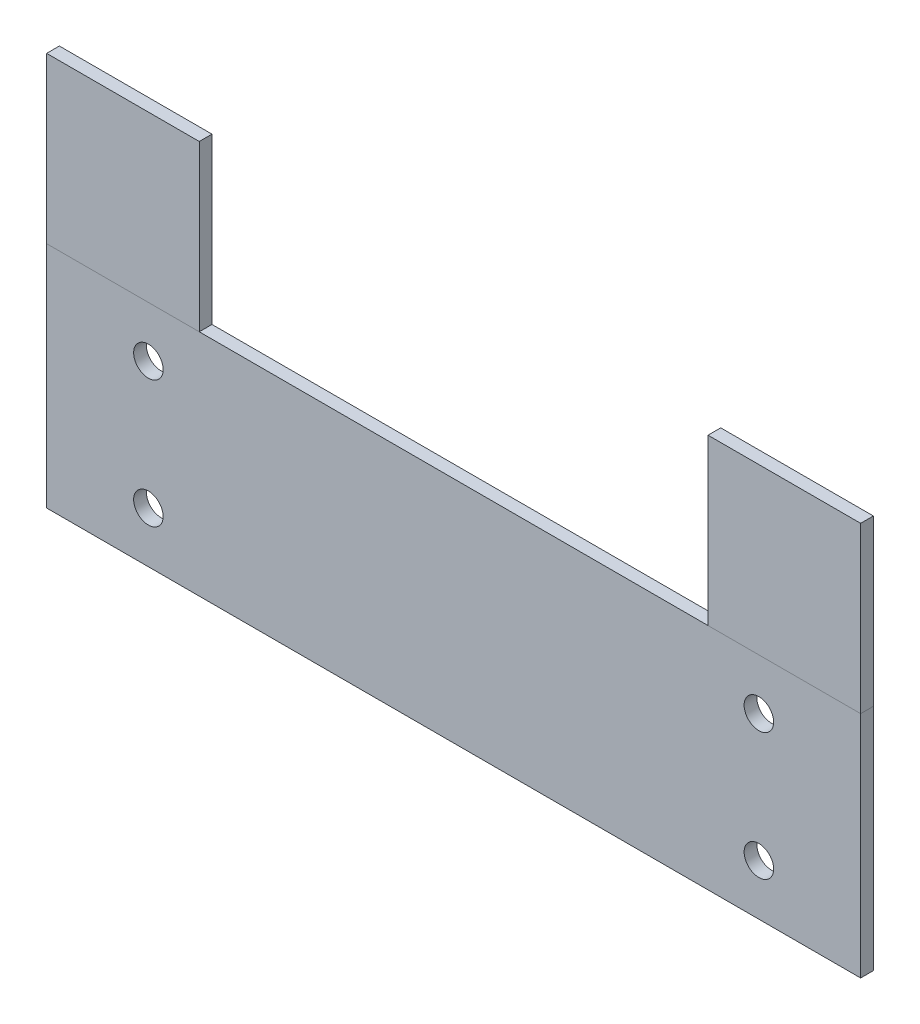
ISO-10303-21;
HEADER;
FILE_DESCRIPTION(('STEP AP214'),'2;1');
FILE_NAME('part.step','',(''),(''),'','','');
FILE_SCHEMA(('AUTOMOTIVE_DESIGN { 1 0 10303 214 1 1 1 1 }'));
ENDSEC;
DATA;
#1=APPLICATION_CONTEXT('core data for automotive mechanical design processes');
#2=APPLICATION_PROTOCOL_DEFINITION('international standard','automotive_design',2000,#1);
#3=PRODUCT_CONTEXT('',#1,'mechanical');
#4=PRODUCT('Part','Part','',(#3));
#5=PRODUCT_RELATED_PRODUCT_CATEGORY('part','',(#4));
#6=PRODUCT_DEFINITION_FORMATION('','',#4);
#7=PRODUCT_DEFINITION_CONTEXT('part definition',#1,'design');
#8=PRODUCT_DEFINITION('design','',#6,#7);
#9=PRODUCT_DEFINITION_SHAPE('','',#8);
#10=(LENGTH_UNIT() NAMED_UNIT(*) SI_UNIT(.MILLI.,.METRE.));
#11=(NAMED_UNIT(*) PLANE_ANGLE_UNIT() SI_UNIT($,.RADIAN.));
#12=(NAMED_UNIT(*) SI_UNIT($,.STERADIAN.) SOLID_ANGLE_UNIT());
#13=UNCERTAINTY_MEASURE_WITH_UNIT(LENGTH_MEASURE(1.E-05),#10,'distance_accuracy_value','');
#14=(GEOMETRIC_REPRESENTATION_CONTEXT(3) GLOBAL_UNCERTAINTY_ASSIGNED_CONTEXT((#13)) GLOBAL_UNIT_ASSIGNED_CONTEXT((#10,
#11,#12)) REPRESENTATION_CONTEXT('',''));
#15=CARTESIAN_POINT('',(0.,0.,0.));
#16=DIRECTION('',(0.,0.,1.));
#17=DIRECTION('',(1.,0.,0.));
#18=AXIS2_PLACEMENT_3D('',#15,#16,#17);
#19=CARTESIAN_POINT('',(50.8,14.2875,0.));
#20=DIRECTION('',(1.,0.,0.));
#21=DIRECTION('',(0.,0.,-1.));
#22=AXIS2_PLACEMENT_3D('',#19,#20,#21);
#23=PLANE('',#22);
#24=DIRECTION('',(0.,1.,0.));
#25=VECTOR('',#24,1.);
#26=CARTESIAN_POINT('',(50.8,14.2875,1.5875));
#27=LINE('',#26,#25);
#28=CARTESIAN_POINT('',(50.8,14.2875,1.5875));
#29=VERTEX_POINT('',#28);
#30=CARTESIAN_POINT('',(50.8,34.8615,1.5875));
#31=VERTEX_POINT('',#30);
#32=EDGE_CURVE('E114',#29,#31,#27,.T.);
#33=ORIENTED_EDGE('',*,*,#32,.F.);
#34=DIRECTION('',(0.,0.,1.));
#35=VECTOR('',#34,1.);
#36=CARTESIAN_POINT('',(50.8,14.2875,0.));
#37=LINE('',#36,#35);
#38=CARTESIAN_POINT('',(50.8,14.2875,0.));
#39=VERTEX_POINT('',#38);
#40=EDGE_CURVE('E12',#39,#29,#37,.T.);
#41=ORIENTED_EDGE('',*,*,#40,.F.);
#42=DIRECTION('',(0.,1.,0.));
#43=VECTOR('',#42,1.);
#44=CARTESIAN_POINT('',(50.8,14.2875,0.));
#45=LINE('',#44,#43);
#46=CARTESIAN_POINT('',(50.8,34.8615,0.));
#47=VERTEX_POINT('',#46);
#48=EDGE_CURVE('E108',#39,#47,#45,.T.);
#49=ORIENTED_EDGE('',*,*,#48,.T.);
#50=DIRECTION('',(0.,0.,1.));
#51=VECTOR('',#50,1.);
#52=CARTESIAN_POINT('',(50.8,34.8615,0.));
#53=LINE('',#52,#51);
#54=EDGE_CURVE('E53',#47,#31,#53,.T.);
#55=ORIENTED_EDGE('',*,*,#54,.T.);
#56=EDGE_LOOP('',(#33,#41,#49,#55));
#57=FACE_BOUND('',#56,.T.);
#58=ADVANCED_FACE('F50',(#57),#23,.T.);
#59=CARTESIAN_POINT('',(50.8,14.2875,0.));
#60=DIRECTION('',(0.,-1.,0.));
#61=DIRECTION('',(0.,0.,-1.));
#62=AXIS2_PLACEMENT_3D('',#59,#60,#61);
#63=PLANE('',#62);
#64=DIRECTION('',(1.,0.,0.));
#65=VECTOR('',#64,1.);
#66=CARTESIAN_POINT('',(50.8,14.2875,1.5875));
#67=LINE('',#66,#65);
#68=CARTESIAN_POINT('',(31.75,14.2875,1.5875));
#69=VERTEX_POINT('',#68);
#70=EDGE_CURVE('E110',#69,#29,#67,.T.);
#71=ORIENTED_EDGE('',*,*,#70,.F.);
#72=DIRECTION('',(0.,0.,1.));
#73=VECTOR('',#72,1.);
#74=CARTESIAN_POINT('',(31.75,14.2875,0.));
#75=LINE('',#74,#73);
#76=CARTESIAN_POINT('',(31.75,14.2875,0.));
#77=VERTEX_POINT('',#76);
#78=EDGE_CURVE('E59',#77,#69,#75,.T.);
#79=ORIENTED_EDGE('',*,*,#78,.F.);
#80=DIRECTION('',(1.,0.,0.));
#81=VECTOR('',#80,1.);
#82=CARTESIAN_POINT('',(50.8,14.2875,0.));
#83=LINE('',#82,#81);
#84=EDGE_CURVE('E105',#77,#39,#83,.T.);
#85=ORIENTED_EDGE('',*,*,#84,.T.);
#86=ORIENTED_EDGE('',*,*,#40,.T.);
#87=EDGE_LOOP('',(#71,#79,#85,#86));
#88=FACE_BOUND('',#87,.T.);
#89=ADVANCED_FACE('F124',(#88),#63,.T.);
#90=CARTESIAN_POINT('',(31.75,14.2875,0.));
#91=DIRECTION('',(-1.,0.,0.));
#92=DIRECTION('',(0.,0.,1.));
#93=AXIS2_PLACEMENT_3D('',#90,#91,#92);
#94=PLANE('',#93);
#95=DIRECTION('',(0.,-1.,0.));
#96=VECTOR('',#95,1.);
#97=CARTESIAN_POINT('',(31.75,14.2875,1.5875));
#98=LINE('',#97,#96);
#99=CARTESIAN_POINT('',(31.75,34.8615,1.5875));
#100=VERTEX_POINT('',#99);
#101=EDGE_CURVE('E100',#100,#69,#98,.T.);
#102=ORIENTED_EDGE('',*,*,#101,.F.);
#103=DIRECTION('',(0.,0.,1.));
#104=VECTOR('',#103,1.);
#105=CARTESIAN_POINT('',(31.75,34.8615,0.));
#106=LINE('',#105,#104);
#107=CARTESIAN_POINT('',(31.75,34.8615,0.));
#108=VERTEX_POINT('',#107);
#109=EDGE_CURVE('E95',#108,#100,#106,.T.);
#110=ORIENTED_EDGE('',*,*,#109,.F.);
#111=DIRECTION('',(0.,-1.,0.));
#112=VECTOR('',#111,1.);
#113=CARTESIAN_POINT('',(31.75,14.2875,0.));
#114=LINE('',#113,#112);
#115=EDGE_CURVE('E98',#108,#77,#114,.T.);
#116=ORIENTED_EDGE('',*,*,#115,.T.);
#117=ORIENTED_EDGE('',*,*,#78,.T.);
#118=EDGE_LOOP('',(#102,#110,#116,#117));
#119=FACE_BOUND('',#118,.T.);
#120=ADVANCED_FACE('F97',(#119),#94,.T.);
#121=CARTESIAN_POINT('',(50.8,34.8615,0.));
#122=DIRECTION('',(0.,1.,0.));
#123=DIRECTION('',(0.,0.,1.));
#124=AXIS2_PLACEMENT_3D('',#121,#122,#123);
#125=PLANE('',#124);
#126=DIRECTION('',(-1.,0.,0.));
#127=VECTOR('',#126,1.);
#128=CARTESIAN_POINT('',(50.8,34.8615,1.5875));
#129=LINE('',#128,#127);
#130=EDGE_CURVE('E117',#31,#100,#129,.T.);
#131=ORIENTED_EDGE('',*,*,#130,.F.);
#132=ORIENTED_EDGE('',*,*,#54,.F.);
#133=DIRECTION('',(-1.,0.,0.));
#134=VECTOR('',#133,1.);
#135=CARTESIAN_POINT('',(50.8,34.8615,0.));
#136=LINE('',#135,#134);
#137=EDGE_CURVE('E104',#47,#108,#136,.T.);
#138=ORIENTED_EDGE('',*,*,#137,.T.);
#139=ORIENTED_EDGE('',*,*,#109,.T.);
#140=EDGE_LOOP('',(#131,#132,#138,#139));
#141=FACE_BOUND('',#140,.T.);
#142=ADVANCED_FACE('F107',(#141),#125,.T.);
#143=CARTESIAN_POINT('',(0.,0.,0.));
#144=DIRECTION('',(0.,0.,1.));
#145=DIRECTION('',(1.,0.,0.));
#146=AXIS2_PLACEMENT_3D('',#143,#144,#145);
#147=PLANE('',#146);
#148=ORIENTED_EDGE('',*,*,#48,.F.);
#149=ORIENTED_EDGE('',*,*,#84,.F.);
#150=ORIENTED_EDGE('',*,*,#115,.F.);
#151=ORIENTED_EDGE('',*,*,#137,.F.);
#152=EDGE_LOOP('',(#148,#149,#150,#151));
#153=FACE_BOUND('',#152,.T.);
#154=ADVANCED_FACE('F103',(#153),#147,.F.);
#155=CARTESIAN_POINT('',(0.,0.,1.5875));
#156=DIRECTION('',(0.,0.,1.));
#157=DIRECTION('',(1.,0.,0.));
#158=AXIS2_PLACEMENT_3D('',#155,#156,#157);
#159=PLANE('',#158);
#160=ORIENTED_EDGE('',*,*,#32,.T.);
#161=ORIENTED_EDGE('',*,*,#130,.T.);
#162=ORIENTED_EDGE('',*,*,#101,.T.);
#163=ORIENTED_EDGE('',*,*,#70,.T.);
#164=EDGE_LOOP('',(#160,#161,#162,#163));
#165=FACE_BOUND('',#164,.T.);
#166=ADVANCED_FACE('F123',(#165),#159,.T.);
#167=CLOSED_SHELL('',(#58,#89,#120,#142,#154,#166));
#168=MANIFOLD_SOLID_BREP('B2',#167);
#169=CARTESIAN_POINT('',(-50.8,14.2875,0.));
#170=DIRECTION('',(-1.,0.,0.));
#171=DIRECTION('',(0.,0.,1.));
#172=AXIS2_PLACEMENT_3D('',#169,#170,#171);
#173=PLANE('',#172);
#174=DIRECTION('',(0.,-1.,0.));
#175=VECTOR('',#174,1.);
#176=CARTESIAN_POINT('',(-50.8,14.2875,1.5875));
#177=LINE('',#176,#175);
#178=CARTESIAN_POINT('',(-50.8,34.8615,1.5875));
#179=VERTEX_POINT('',#178);
#180=CARTESIAN_POINT('',(-50.8,14.2875,1.5875));
#181=VERTEX_POINT('',#180);
#182=EDGE_CURVE('E247',#179,#181,#177,.T.);
#183=ORIENTED_EDGE('',*,*,#182,.F.);
#184=DIRECTION('',(0.,0.,1.));
#185=VECTOR('',#184,1.);
#186=CARTESIAN_POINT('',(-50.8,34.8615,0.));
#187=LINE('',#186,#185);
#188=CARTESIAN_POINT('',(-50.8,34.8615,0.));
#189=VERTEX_POINT('',#188);
#190=EDGE_CURVE('E48',#189,#179,#187,.T.);
#191=ORIENTED_EDGE('',*,*,#190,.F.);
#192=DIRECTION('',(0.,-1.,0.));
#193=VECTOR('',#192,1.);
#194=CARTESIAN_POINT('',(-50.8,14.2875,0.));
#195=LINE('',#194,#193);
#196=CARTESIAN_POINT('',(-50.8,14.2875,0.));
#197=VERTEX_POINT('',#196);
#198=EDGE_CURVE('E241',#189,#197,#195,.T.);
#199=ORIENTED_EDGE('',*,*,#198,.T.);
#200=DIRECTION('',(0.,0.,1.));
#201=VECTOR('',#200,1.);
#202=CARTESIAN_POINT('',(-50.8,14.2875,0.));
#203=LINE('',#202,#201);
#204=EDGE_CURVE('E186',#197,#181,#203,.T.);
#205=ORIENTED_EDGE('',*,*,#204,.T.);
#206=EDGE_LOOP('',(#183,#191,#199,#205));
#207=FACE_BOUND('',#206,.T.);
#208=ADVANCED_FACE('F183',(#207),#173,.T.);
#209=CARTESIAN_POINT('',(-50.8,34.8615,0.));
#210=DIRECTION('',(0.,1.,0.));
#211=DIRECTION('',(0.,0.,1.));
#212=AXIS2_PLACEMENT_3D('',#209,#210,#211);
#213=PLANE('',#212);
#214=DIRECTION('',(-1.,0.,0.));
#215=VECTOR('',#214,1.);
#216=CARTESIAN_POINT('',(-50.8,34.8615,1.5875));
#217=LINE('',#216,#215);
#218=CARTESIAN_POINT('',(-31.75,34.8615,1.5875));
#219=VERTEX_POINT('',#218);
#220=EDGE_CURVE('E243',#219,#179,#217,.T.);
#221=ORIENTED_EDGE('',*,*,#220,.F.);
#222=DIRECTION('',(0.,0.,1.));
#223=VECTOR('',#222,1.);
#224=CARTESIAN_POINT('',(-31.75,34.8615,0.));
#225=LINE('',#224,#223);
#226=CARTESIAN_POINT('',(-31.75,34.8615,0.));
#227=VERTEX_POINT('',#226);
#228=EDGE_CURVE('E192',#227,#219,#225,.T.);
#229=ORIENTED_EDGE('',*,*,#228,.F.);
#230=DIRECTION('',(-1.,0.,0.));
#231=VECTOR('',#230,1.);
#232=CARTESIAN_POINT('',(-50.8,34.8615,0.));
#233=LINE('',#232,#231);
#234=EDGE_CURVE('E238',#227,#189,#233,.T.);
#235=ORIENTED_EDGE('',*,*,#234,.T.);
#236=ORIENTED_EDGE('',*,*,#190,.T.);
#237=EDGE_LOOP('',(#221,#229,#235,#236));
#238=FACE_BOUND('',#237,.T.);
#239=ADVANCED_FACE('F257',(#238),#213,.T.);
#240=CARTESIAN_POINT('',(-31.75,14.2875,0.));
#241=DIRECTION('',(1.,0.,0.));
#242=DIRECTION('',(0.,0.,-1.));
#243=AXIS2_PLACEMENT_3D('',#240,#241,#242);
#244=PLANE('',#243);
#245=DIRECTION('',(0.,1.,0.));
#246=VECTOR('',#245,1.);
#247=CARTESIAN_POINT('',(-31.75,14.2875,1.5875));
#248=LINE('',#247,#246);
#249=CARTESIAN_POINT('',(-31.75,14.2875,1.5875));
#250=VERTEX_POINT('',#249);
#251=EDGE_CURVE('E233',#250,#219,#248,.T.);
#252=ORIENTED_EDGE('',*,*,#251,.F.);
#253=DIRECTION('',(0.,0.,1.));
#254=VECTOR('',#253,1.);
#255=CARTESIAN_POINT('',(-31.75,14.2875,0.));
#256=LINE('',#255,#254);
#257=CARTESIAN_POINT('',(-31.75,14.2875,0.));
#258=VERTEX_POINT('',#257);
#259=EDGE_CURVE('E228',#258,#250,#256,.T.);
#260=ORIENTED_EDGE('',*,*,#259,.F.);
#261=DIRECTION('',(0.,1.,0.));
#262=VECTOR('',#261,1.);
#263=CARTESIAN_POINT('',(-31.75,14.2875,0.));
#264=LINE('',#263,#262);
#265=EDGE_CURVE('E231',#258,#227,#264,.T.);
#266=ORIENTED_EDGE('',*,*,#265,.T.);
#267=ORIENTED_EDGE('',*,*,#228,.T.);
#268=EDGE_LOOP('',(#252,#260,#266,#267));
#269=FACE_BOUND('',#268,.T.);
#270=ADVANCED_FACE('F230',(#269),#244,.T.);
#271=CARTESIAN_POINT('',(-50.8,14.2875,0.));
#272=DIRECTION('',(0.,-1.,0.));
#273=DIRECTION('',(0.,0.,-1.));
#274=AXIS2_PLACEMENT_3D('',#271,#272,#273);
#275=PLANE('',#274);
#276=DIRECTION('',(1.,0.,0.));
#277=VECTOR('',#276,1.);
#278=CARTESIAN_POINT('',(-50.8,14.2875,1.5875));
#279=LINE('',#278,#277);
#280=EDGE_CURVE('E250',#181,#250,#279,.T.);
#281=ORIENTED_EDGE('',*,*,#280,.F.);
#282=ORIENTED_EDGE('',*,*,#204,.F.);
#283=DIRECTION('',(1.,0.,0.));
#284=VECTOR('',#283,1.);
#285=CARTESIAN_POINT('',(-50.8,14.2875,0.));
#286=LINE('',#285,#284);
#287=EDGE_CURVE('E237',#197,#258,#286,.T.);
#288=ORIENTED_EDGE('',*,*,#287,.T.);
#289=ORIENTED_EDGE('',*,*,#259,.T.);
#290=EDGE_LOOP('',(#281,#282,#288,#289));
#291=FACE_BOUND('',#290,.T.);
#292=ADVANCED_FACE('F240',(#291),#275,.T.);
#293=CARTESIAN_POINT('',(0.,0.,0.));
#294=DIRECTION('',(0.,0.,-1.));
#295=DIRECTION('',(-1.,0.,0.));
#296=AXIS2_PLACEMENT_3D('',#293,#294,#295);
#297=PLANE('',#296);
#298=ORIENTED_EDGE('',*,*,#198,.F.);
#299=ORIENTED_EDGE('',*,*,#234,.F.);
#300=ORIENTED_EDGE('',*,*,#265,.F.);
#301=ORIENTED_EDGE('',*,*,#287,.F.);
#302=EDGE_LOOP('',(#298,#299,#300,#301));
#303=FACE_BOUND('',#302,.T.);
#304=ADVANCED_FACE('F236',(#303),#297,.T.);
#305=CARTESIAN_POINT('',(0.,0.,1.5875));
#306=DIRECTION('',(0.,0.,-1.));
#307=DIRECTION('',(-1.,0.,0.));
#308=AXIS2_PLACEMENT_3D('',#305,#306,#307);
#309=PLANE('',#308);
#310=ORIENTED_EDGE('',*,*,#182,.T.);
#311=ORIENTED_EDGE('',*,*,#280,.T.);
#312=ORIENTED_EDGE('',*,*,#251,.T.);
#313=ORIENTED_EDGE('',*,*,#220,.T.);
#314=EDGE_LOOP('',(#310,#311,#312,#313));
#315=FACE_BOUND('',#314,.T.);
#316=ADVANCED_FACE('F256',(#315),#309,.F.);
#317=CLOSED_SHELL('',(#208,#239,#270,#292,#304,#316));
#318=MANIFOLD_SOLID_BREP('B6',#317);
#319=CARTESIAN_POINT('',(50.8,14.2875,1.5875));
#320=DIRECTION('',(-1.,0.,0.));
#321=DIRECTION('',(0.,-1.,0.));
#322=AXIS2_PLACEMENT_3D('',#319,#320,#321);
#323=PLANE('',#322);
#324=DIRECTION('',(0.,1.,0.));
#325=VECTOR('',#324,1.);
#326=CARTESIAN_POINT('',(50.8,14.2875,0.));
#327=LINE('',#326,#325);
#328=CARTESIAN_POINT('',(50.8,-14.2875,0.));
#329=VERTEX_POINT('',#328);
#330=CARTESIAN_POINT('',(50.8,14.2875,0.));
#331=VERTEX_POINT('',#330);
#332=EDGE_CURVE('E374',#329,#331,#327,.T.);
#333=ORIENTED_EDGE('',*,*,#332,.T.);
#334=DIRECTION('',(0.,0.,-1.));
#335=VECTOR('',#334,1.);
#336=CARTESIAN_POINT('',(50.8,14.2875,1.5875));
#337=LINE('',#336,#335);
#338=CARTESIAN_POINT('',(50.8,14.2875,1.5875));
#339=VERTEX_POINT('',#338);
#340=EDGE_CURVE('E181',#339,#331,#337,.T.);
#341=ORIENTED_EDGE('',*,*,#340,.F.);
#342=DIRECTION('',(0.,1.,0.));
#343=VECTOR('',#342,1.);
#344=CARTESIAN_POINT('',(50.8,14.2875,1.5875));
#345=LINE('',#344,#343);
#346=CARTESIAN_POINT('',(50.8,-14.2875,1.5875));
#347=VERTEX_POINT('',#346);
#348=EDGE_CURVE('E358',#347,#339,#345,.T.);
#349=ORIENTED_EDGE('',*,*,#348,.F.);
#350=DIRECTION('',(0.,0.,-1.));
#351=VECTOR('',#350,1.);
#352=CARTESIAN_POINT('',(50.8,-14.2875,1.5875));
#353=LINE('',#352,#351);
#354=EDGE_CURVE('E370',#347,#329,#353,.T.);
#355=ORIENTED_EDGE('',*,*,#354,.T.);
#356=EDGE_LOOP('',(#333,#341,#349,#355));
#357=FACE_BOUND('',#356,.T.);
#358=ADVANCED_FACE('F306',(#357),#323,.F.);
#359=CARTESIAN_POINT('',(-50.8,14.2875,1.5875));
#360=DIRECTION('',(0.,-1.,0.));
#361=DIRECTION('',(0.,0.,-1.));
#362=AXIS2_PLACEMENT_3D('',#359,#360,#361);
#363=PLANE('',#362);
#364=DIRECTION('',(-1.,0.,0.));
#365=VECTOR('',#364,1.);
#366=CARTESIAN_POINT('',(-50.8,14.2875,0.));
#367=LINE('',#366,#365);
#368=CARTESIAN_POINT('',(-50.8,14.2875,0.));
#369=VERTEX_POINT('',#368);
#370=EDGE_CURVE('E363',#331,#369,#367,.T.);
#371=ORIENTED_EDGE('',*,*,#370,.T.);
#372=DIRECTION('',(0.,0.,-1.));
#373=VECTOR('',#372,1.);
#374=CARTESIAN_POINT('',(-50.8,14.2875,1.5875));
#375=LINE('',#374,#373);
#376=CARTESIAN_POINT('',(-50.8,14.2875,1.5875));
#377=VERTEX_POINT('',#376);
#378=EDGE_CURVE('E315',#377,#369,#375,.T.);
#379=ORIENTED_EDGE('',*,*,#378,.F.);
#380=DIRECTION('',(-1.,0.,0.));
#381=VECTOR('',#380,1.);
#382=CARTESIAN_POINT('',(-50.8,14.2875,1.5875));
#383=LINE('',#382,#381);
#384=EDGE_CURVE('E353',#339,#377,#383,.T.);
#385=ORIENTED_EDGE('',*,*,#384,.F.);
#386=ORIENTED_EDGE('',*,*,#340,.T.);
#387=EDGE_LOOP('',(#371,#379,#385,#386));
#388=FACE_BOUND('',#387,.T.);
#389=ADVANCED_FACE('F362',(#388),#363,.F.);
#390=CARTESIAN_POINT('',(-50.8,14.2875,1.5875));
#391=DIRECTION('',(1.,0.,0.));
#392=DIRECTION('',(0.,0.,-1.));
#393=AXIS2_PLACEMENT_3D('',#390,#391,#392);
#394=PLANE('',#393);
#395=DIRECTION('',(0.,-1.,0.));
#396=VECTOR('',#395,1.);
#397=CARTESIAN_POINT('',(-50.8,14.2875,0.));
#398=LINE('',#397,#396);
#399=CARTESIAN_POINT('',(-50.8,-14.2875,0.));
#400=VERTEX_POINT('',#399);
#401=EDGE_CURVE('E340',#369,#400,#398,.T.);
#402=ORIENTED_EDGE('',*,*,#401,.T.);
#403=DIRECTION('',(0.,0.,-1.));
#404=VECTOR('',#403,1.);
#405=CARTESIAN_POINT('',(-50.8,-14.2875,1.5875));
#406=LINE('',#405,#404);
#407=CARTESIAN_POINT('',(-50.8,-14.2875,1.5875));
#408=VERTEX_POINT('',#407);
#409=EDGE_CURVE('E365',#408,#400,#406,.T.);
#410=ORIENTED_EDGE('',*,*,#409,.F.);
#411=DIRECTION('',(0.,-1.,0.));
#412=VECTOR('',#411,1.);
#413=CARTESIAN_POINT('',(-50.8,14.2875,1.5875));
#414=LINE('',#413,#412);
#415=EDGE_CURVE('E356',#377,#408,#414,.T.);
#416=ORIENTED_EDGE('',*,*,#415,.F.);
#417=ORIENTED_EDGE('',*,*,#378,.T.);
#418=EDGE_LOOP('',(#402,#410,#416,#417));
#419=FACE_BOUND('',#418,.T.);
#420=ADVANCED_FACE('F366',(#419),#394,.F.);
#421=CARTESIAN_POINT('',(-50.8,-14.2875,1.5875));
#422=DIRECTION('',(0.,1.,0.));
#423=DIRECTION('',(0.,0.,1.));
#424=AXIS2_PLACEMENT_3D('',#421,#422,#423);
#425=PLANE('',#424);
#426=DIRECTION('',(1.,0.,0.));
#427=VECTOR('',#426,1.);
#428=CARTESIAN_POINT('',(-50.8,-14.2875,0.));
#429=LINE('',#428,#427);
#430=EDGE_CURVE('E346',#400,#329,#429,.T.);
#431=ORIENTED_EDGE('',*,*,#430,.T.);
#432=ORIENTED_EDGE('',*,*,#354,.F.);
#433=DIRECTION('',(1.,0.,0.));
#434=VECTOR('',#433,1.);
#435=CARTESIAN_POINT('',(-50.8,-14.2875,1.5875));
#436=LINE('',#435,#434);
#437=EDGE_CURVE('E323',#408,#347,#436,.T.);
#438=ORIENTED_EDGE('',*,*,#437,.F.);
#439=ORIENTED_EDGE('',*,*,#409,.T.);
#440=EDGE_LOOP('',(#431,#432,#438,#439));
#441=FACE_BOUND('',#440,.T.);
#442=ADVANCED_FACE('F388',(#441),#425,.F.);
#443=CARTESIAN_POINT('',(0.,0.,1.5875));
#444=DIRECTION('',(0.,0.,1.));
#445=DIRECTION('',(1.,0.,0.));
#446=AXIS2_PLACEMENT_3D('',#443,#444,#445);
#447=PLANE('',#446);
#448=CARTESIAN_POINT('',(38.1,7.9375,1.5875));
#449=DIRECTION('',(0.,0.,-1.));
#450=DIRECTION('',(-1.,0.,0.));
#451=AXIS2_PLACEMENT_3D('',#448,#449,#450);
#452=CIRCLE('',#451,1.8415);
#453=CARTESIAN_POINT('',(36.2585,7.9375,1.5875));
#454=VERTEX_POINT('',#453);
#455=EDGE_CURVE('E419',#454,#454,#452,.T.);
#456=ORIENTED_EDGE('',*,*,#455,.T.);
#457=EDGE_LOOP('',(#456));
#458=FACE_BOUND('',#457,.T.);
#459=CARTESIAN_POINT('',(38.1,-7.9375,1.5875));
#460=DIRECTION('',(0.,0.,-1.));
#461=DIRECTION('',(-1.,0.,0.));
#462=AXIS2_PLACEMENT_3D('',#459,#460,#461);
#463=CIRCLE('',#462,1.8415);
#464=CARTESIAN_POINT('',(36.2585,-7.9375,1.5875));
#465=VERTEX_POINT('',#464);
#466=EDGE_CURVE('E411',#465,#465,#463,.T.);
#467=ORIENTED_EDGE('',*,*,#466,.T.);
#468=EDGE_LOOP('',(#467));
#469=FACE_BOUND('',#468,.T.);
#470=CARTESIAN_POINT('',(-38.1,7.9375,1.5875));
#471=DIRECTION('',(0.,0.,1.));
#472=DIRECTION('',(1.,0.,0.));
#473=AXIS2_PLACEMENT_3D('',#470,#471,#472);
#474=CIRCLE('',#473,1.8415);
#475=CARTESIAN_POINT('',(-36.2585,7.9375,1.5875));
#476=VERTEX_POINT('',#475);
#477=EDGE_CURVE('E404',#476,#476,#474,.T.);
#478=ORIENTED_EDGE('',*,*,#477,.F.);
#479=EDGE_LOOP('',(#478));
#480=FACE_BOUND('',#479,.T.);
#481=CARTESIAN_POINT('',(-38.1,-7.9375,1.5875));
#482=DIRECTION('',(0.,0.,1.));
#483=DIRECTION('',(1.,0.,0.));
#484=AXIS2_PLACEMENT_3D('',#481,#482,#483);
#485=CIRCLE('',#484,1.8415);
#486=CARTESIAN_POINT('',(-36.2585,-7.9375,1.5875));
#487=VERTEX_POINT('',#486);
#488=EDGE_CURVE('E395',#487,#487,#485,.T.);
#489=ORIENTED_EDGE('',*,*,#488,.F.);
#490=EDGE_LOOP('',(#489));
#491=FACE_BOUND('',#490,.T.);
#492=ORIENTED_EDGE('',*,*,#348,.T.);
#493=ORIENTED_EDGE('',*,*,#384,.T.);
#494=ORIENTED_EDGE('',*,*,#415,.T.);
#495=ORIENTED_EDGE('',*,*,#437,.T.);
#496=EDGE_LOOP('',(#492,#493,#494,#495));
#497=FACE_BOUND('',#496,.T.);
#498=ADVANCED_FACE('F354',(#458,#469,#480,#491,#497),#447,.T.);
#499=CARTESIAN_POINT('',(0.,0.,0.));
#500=DIRECTION('',(0.,0.,1.));
#501=DIRECTION('',(1.,0.,0.));
#502=AXIS2_PLACEMENT_3D('',#499,#500,#501);
#503=PLANE('',#502);
#504=CARTESIAN_POINT('',(38.1,7.9375,0.));
#505=DIRECTION('',(0.,0.,-1.));
#506=DIRECTION('',(-1.,0.,0.));
#507=AXIS2_PLACEMENT_3D('',#504,#505,#506);
#508=CIRCLE('',#507,1.8415);
#509=CARTESIAN_POINT('',(36.2585,7.9375,0.));
#510=VERTEX_POINT('',#509);
#511=EDGE_CURVE('E400',#510,#510,#508,.T.);
#512=ORIENTED_EDGE('',*,*,#511,.F.);
#513=EDGE_LOOP('',(#512));
#514=FACE_BOUND('',#513,.T.);
#515=CARTESIAN_POINT('',(38.1,-7.9375,0.));
#516=DIRECTION('',(0.,0.,-1.));
#517=DIRECTION('',(-1.,0.,0.));
#518=AXIS2_PLACEMENT_3D('',#515,#516,#517);
#519=CIRCLE('',#518,1.8415);
#520=CARTESIAN_POINT('',(36.2585,-7.9375,0.));
#521=VERTEX_POINT('',#520);
#522=EDGE_CURVE('E415',#521,#521,#519,.T.);
#523=ORIENTED_EDGE('',*,*,#522,.F.);
#524=EDGE_LOOP('',(#523));
#525=FACE_BOUND('',#524,.T.);
#526=CARTESIAN_POINT('',(-38.1,7.9375,0.));
#527=DIRECTION('',(0.,0.,1.));
#528=DIRECTION('',(1.,0.,0.));
#529=AXIS2_PLACEMENT_3D('',#526,#527,#528);
#530=CIRCLE('',#529,1.8415);
#531=CARTESIAN_POINT('',(-36.2585,7.9375,0.));
#532=VERTEX_POINT('',#531);
#533=EDGE_CURVE('E378',#532,#532,#530,.T.);
#534=ORIENTED_EDGE('',*,*,#533,.T.);
#535=EDGE_LOOP('',(#534));
#536=FACE_BOUND('',#535,.T.);
#537=CARTESIAN_POINT('',(-38.1,-7.9375,0.));
#538=DIRECTION('',(0.,0.,1.));
#539=DIRECTION('',(1.,0.,0.));
#540=AXIS2_PLACEMENT_3D('',#537,#538,#539);
#541=CIRCLE('',#540,1.8415);
#542=CARTESIAN_POINT('',(-36.2585,-7.9375,0.));
#543=VERTEX_POINT('',#542);
#544=EDGE_CURVE('E399',#543,#543,#541,.T.);
#545=ORIENTED_EDGE('',*,*,#544,.T.);
#546=EDGE_LOOP('',(#545));
#547=FACE_BOUND('',#546,.T.);
#548=ORIENTED_EDGE('',*,*,#332,.F.);
#549=ORIENTED_EDGE('',*,*,#430,.F.);
#550=ORIENTED_EDGE('',*,*,#401,.F.);
#551=ORIENTED_EDGE('',*,*,#370,.F.);
#552=EDGE_LOOP('',(#548,#549,#550,#551));
#553=FACE_BOUND('',#552,.T.);
#554=ADVANCED_FACE('F391',(#514,#525,#536,#547,#553),#503,.F.);
#555=CARTESIAN_POINT('',(-38.1,-7.9375,0.));
#556=DIRECTION('',(0.,0.,1.));
#557=DIRECTION('',(1.,0.,0.));
#558=AXIS2_PLACEMENT_3D('',#555,#556,#557);
#559=CYLINDRICAL_SURFACE('',#558,1.8415);
#560=ORIENTED_EDGE('',*,*,#544,.F.);
#561=EDGE_LOOP('',(#560));
#562=FACE_BOUND('',#561,.T.);
#563=ORIENTED_EDGE('',*,*,#488,.T.);
#564=EDGE_LOOP('',(#563));
#565=FACE_BOUND('',#564,.T.);
#566=ADVANCED_FACE('F432',(#562,#565),#559,.F.);
#567=CARTESIAN_POINT('',(-38.1,7.9375,0.));
#568=DIRECTION('',(0.,0.,1.));
#569=DIRECTION('',(1.,0.,0.));
#570=AXIS2_PLACEMENT_3D('',#567,#568,#569);
#571=CYLINDRICAL_SURFACE('',#570,1.8415);
#572=ORIENTED_EDGE('',*,*,#533,.F.);
#573=EDGE_LOOP('',(#572));
#574=FACE_BOUND('',#573,.T.);
#575=ORIENTED_EDGE('',*,*,#477,.T.);
#576=EDGE_LOOP('',(#575));
#577=FACE_BOUND('',#576,.T.);
#578=ADVANCED_FACE('F442',(#574,#577),#571,.F.);
#579=CARTESIAN_POINT('',(38.1,-7.9375,0.));
#580=DIRECTION('',(0.,0.,1.));
#581=DIRECTION('',(1.,0.,0.));
#582=AXIS2_PLACEMENT_3D('',#579,#580,#581);
#583=CYLINDRICAL_SURFACE('',#582,1.8415);
#584=ORIENTED_EDGE('',*,*,#522,.T.);
#585=EDGE_LOOP('',(#584));
#586=FACE_BOUND('',#585,.T.);
#587=ORIENTED_EDGE('',*,*,#466,.F.);
#588=EDGE_LOOP('',(#587));
#589=FACE_BOUND('',#588,.T.);
#590=ADVANCED_FACE('F489',(#586,#589),#583,.F.);
#591=CARTESIAN_POINT('',(38.1,7.9375,0.));
#592=DIRECTION('',(0.,0.,1.));
#593=DIRECTION('',(1.,0.,0.));
#594=AXIS2_PLACEMENT_3D('',#591,#592,#593);
#595=CYLINDRICAL_SURFACE('',#594,1.8415);
#596=ORIENTED_EDGE('',*,*,#511,.T.);
#597=EDGE_LOOP('',(#596));
#598=FACE_BOUND('',#597,.T.);
#599=ORIENTED_EDGE('',*,*,#455,.F.);
#600=EDGE_LOOP('',(#599));
#601=FACE_BOUND('',#600,.T.);
#602=ADVANCED_FACE('F427',(#598,#601),#595,.F.);
#603=CLOSED_SHELL('',(#358,#389,#420,#442,#498,#554,#566,#578,#590,#602));
#604=MANIFOLD_SOLID_BREP('B42',#603);
#605=ADVANCED_BREP_SHAPE_REPRESENTATION('',(#18,#168,#318,#604),#14);
#606=SHAPE_DEFINITION_REPRESENTATION(#9,#605);
ENDSEC;
END-ISO-10303-21;
